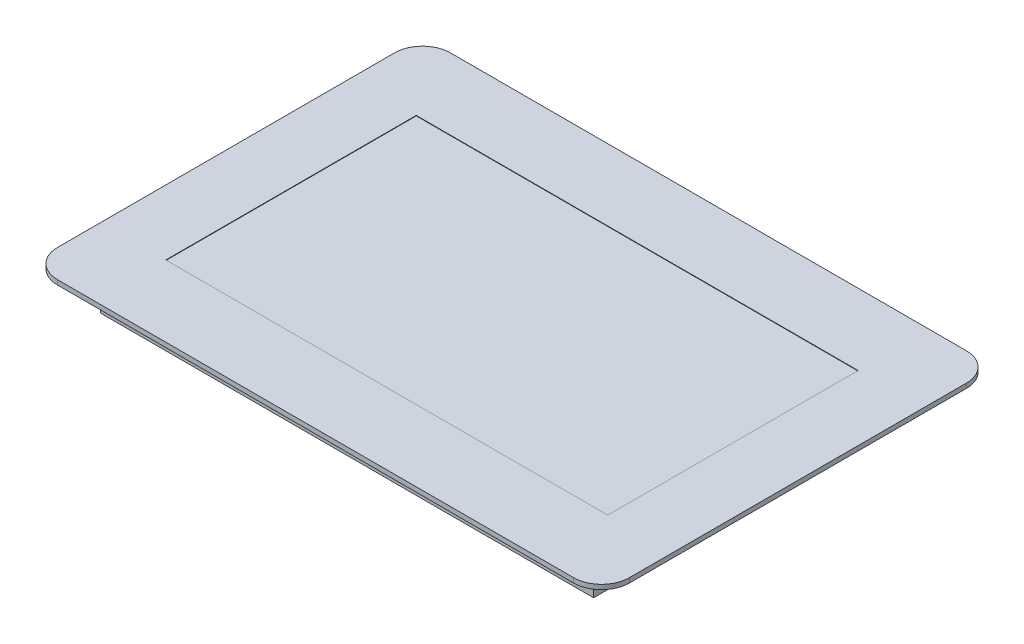
ISO-10303-21;
HEADER;
FILE_DESCRIPTION(('STEP AP214'),'2;1');
FILE_NAME('part.step','',(''),(''),'','','');
FILE_SCHEMA(('AUTOMOTIVE_DESIGN { 1 0 10303 214 1 1 1 1 }'));
ENDSEC;
DATA;
#1=APPLICATION_CONTEXT('core data for automotive mechanical design processes');
#2=APPLICATION_PROTOCOL_DEFINITION('international standard','automotive_design',2000,#1);
#3=PRODUCT_CONTEXT('',#1,'mechanical');
#4=PRODUCT('Part','Part','',(#3));
#5=PRODUCT_RELATED_PRODUCT_CATEGORY('part','',(#4));
#6=PRODUCT_DEFINITION_FORMATION('','',#4);
#7=PRODUCT_DEFINITION_CONTEXT('part definition',#1,'design');
#8=PRODUCT_DEFINITION('design','',#6,#7);
#9=PRODUCT_DEFINITION_SHAPE('','',#8);
#10=(LENGTH_UNIT() NAMED_UNIT(*) SI_UNIT(.MILLI.,.METRE.));
#11=(NAMED_UNIT(*) PLANE_ANGLE_UNIT() SI_UNIT($,.RADIAN.));
#12=(NAMED_UNIT(*) SI_UNIT($,.STERADIAN.) SOLID_ANGLE_UNIT());
#13=UNCERTAINTY_MEASURE_WITH_UNIT(LENGTH_MEASURE(1.E-05),#10,'distance_accuracy_value','');
#14=(GEOMETRIC_REPRESENTATION_CONTEXT(3) GLOBAL_UNCERTAINTY_ASSIGNED_CONTEXT((#13)) GLOBAL_UNIT_ASSIGNED_CONTEXT((#10,
#11,#12)) REPRESENTATION_CONTEXT('',''));
#15=CARTESIAN_POINT('',(0.,0.,0.));
#16=DIRECTION('',(0.,0.,1.));
#17=DIRECTION('',(1.,0.,0.));
#18=AXIS2_PLACEMENT_3D('',#15,#16,#17);
#19=CARTESIAN_POINT('',(53.,8.4,-33.85));
#20=DIRECTION('',(-1.,0.,0.));
#21=DIRECTION('',(0.,0.,1.));
#22=AXIS2_PLACEMENT_3D('',#19,#20,#21);
#23=PLANE('',#22);
#24=DIRECTION('',(0.,0.,-1.));
#25=VECTOR('',#24,1.);
#26=CARTESIAN_POINT('',(53.,7.4,-33.85));
#27=LINE('',#26,#25);
#28=CARTESIAN_POINT('',(53.,7.4,33.85));
#29=VERTEX_POINT('',#28);
#30=CARTESIAN_POINT('',(53.,7.4,-33.85));
#31=VERTEX_POINT('',#30);
#32=EDGE_CURVE('E254',#29,#31,#27,.T.);
#33=ORIENTED_EDGE('',*,*,#32,.F.);
#34=DIRECTION('',(0.,-1.,0.));
#35=VECTOR('',#34,1.);
#36=CARTESIAN_POINT('',(53.,8.4,33.85));
#37=LINE('',#36,#35);
#38=CARTESIAN_POINT('',(53.,0.,33.85));
#39=VERTEX_POINT('',#38);
#40=EDGE_CURVE('E269',#29,#39,#37,.T.);
#41=ORIENTED_EDGE('',*,*,#40,.T.);
#42=DIRECTION('',(0.,0.,-1.));
#43=VECTOR('',#42,1.);
#44=CARTESIAN_POINT('',(53.,0.,-33.85));
#45=LINE('',#44,#43);
#46=CARTESIAN_POINT('',(53.,0.,-33.85));
#47=VERTEX_POINT('',#46);
#48=EDGE_CURVE('E257',#39,#47,#45,.T.);
#49=ORIENTED_EDGE('',*,*,#48,.T.);
#50=DIRECTION('',(0.,-1.,0.));
#51=VECTOR('',#50,1.);
#52=CARTESIAN_POINT('',(53.,8.4,-33.85));
#53=LINE('',#52,#51);
#54=EDGE_CURVE('E42',#31,#47,#53,.T.);
#55=ORIENTED_EDGE('',*,*,#54,.F.);
#56=EDGE_LOOP('',(#33,#41,#49,#55));
#57=FACE_BOUND('',#56,.T.);
#58=ADVANCED_FACE('F35',(#57),#23,.F.);
#59=CARTESIAN_POINT('',(-53.,8.4,-33.85));
#60=DIRECTION('',(0.,0.,1.));
#61=DIRECTION('',(1.,0.,0.));
#62=AXIS2_PLACEMENT_3D('',#59,#60,#61);
#63=PLANE('',#62);
#64=DIRECTION('',(-1.,0.,0.));
#65=VECTOR('',#64,1.);
#66=CARTESIAN_POINT('',(-53.,7.4,-33.85));
#67=LINE('',#66,#65);
#68=CARTESIAN_POINT('',(-53.,7.4,-33.85));
#69=VERTEX_POINT('',#68);
#70=EDGE_CURVE('E57',#31,#69,#67,.T.);
#71=ORIENTED_EDGE('',*,*,#70,.F.);
#72=ORIENTED_EDGE('',*,*,#54,.T.);
#73=DIRECTION('',(-1.,0.,0.));
#74=VECTOR('',#73,1.);
#75=CARTESIAN_POINT('',(-53.,0.,-33.85));
#76=LINE('',#75,#74);
#77=CARTESIAN_POINT('',(-53.,0.,-33.85));
#78=VERTEX_POINT('',#77);
#79=EDGE_CURVE('E260',#47,#78,#76,.T.);
#80=ORIENTED_EDGE('',*,*,#79,.T.);
#81=DIRECTION('',(0.,-1.,0.));
#82=VECTOR('',#81,1.);
#83=CARTESIAN_POINT('',(-53.,8.4,-33.85));
#84=LINE('',#83,#82);
#85=EDGE_CURVE('E273',#69,#78,#84,.T.);
#86=ORIENTED_EDGE('',*,*,#85,.F.);
#87=EDGE_LOOP('',(#71,#72,#80,#86));
#88=FACE_BOUND('',#87,.T.);
#89=ADVANCED_FACE('F275',(#88),#63,.F.);
#90=CARTESIAN_POINT('',(-53.,8.4,-33.85));
#91=DIRECTION('',(1.,0.,0.));
#92=DIRECTION('',(0.,0.,-1.));
#93=AXIS2_PLACEMENT_3D('',#90,#91,#92);
#94=PLANE('',#93);
#95=DIRECTION('',(0.,0.,1.));
#96=VECTOR('',#95,1.);
#97=CARTESIAN_POINT('',(-53.,7.4,-33.85));
#98=LINE('',#97,#96);
#99=CARTESIAN_POINT('',(-53.,7.4,33.85));
#100=VERTEX_POINT('',#99);
#101=EDGE_CURVE('E237',#69,#100,#98,.T.);
#102=ORIENTED_EDGE('',*,*,#101,.F.);
#103=ORIENTED_EDGE('',*,*,#85,.T.);
#104=DIRECTION('',(0.,0.,1.));
#105=VECTOR('',#104,1.);
#106=CARTESIAN_POINT('',(-53.,0.,-33.85));
#107=LINE('',#106,#105);
#108=CARTESIAN_POINT('',(-53.,0.,33.85));
#109=VERTEX_POINT('',#108);
#110=EDGE_CURVE('E263',#78,#109,#107,.T.);
#111=ORIENTED_EDGE('',*,*,#110,.T.);
#112=DIRECTION('',(0.,-1.,0.));
#113=VECTOR('',#112,1.);
#114=CARTESIAN_POINT('',(-53.,8.4,33.85));
#115=LINE('',#114,#113);
#116=EDGE_CURVE('E271',#100,#109,#115,.T.);
#117=ORIENTED_EDGE('',*,*,#116,.F.);
#118=EDGE_LOOP('',(#102,#103,#111,#117));
#119=FACE_BOUND('',#118,.T.);
#120=ADVANCED_FACE('F287',(#119),#94,.F.);
#121=CARTESIAN_POINT('',(-53.,8.4,33.85));
#122=DIRECTION('',(0.,0.,-1.));
#123=DIRECTION('',(-1.,0.,0.));
#124=AXIS2_PLACEMENT_3D('',#121,#122,#123);
#125=PLANE('',#124);
#126=DIRECTION('',(1.,0.,0.));
#127=VECTOR('',#126,1.);
#128=CARTESIAN_POINT('',(-53.,7.4,33.85));
#129=LINE('',#128,#127);
#130=EDGE_CURVE('E11',#100,#29,#129,.T.);
#131=ORIENTED_EDGE('',*,*,#130,.F.);
#132=ORIENTED_EDGE('',*,*,#116,.T.);
#133=DIRECTION('',(1.,0.,0.));
#134=VECTOR('',#133,1.);
#135=CARTESIAN_POINT('',(-53.,0.,33.85));
#136=LINE('',#135,#134);
#137=EDGE_CURVE('E266',#109,#39,#136,.T.);
#138=ORIENTED_EDGE('',*,*,#137,.T.);
#139=ORIENTED_EDGE('',*,*,#40,.F.);
#140=EDGE_LOOP('',(#131,#132,#138,#139));
#141=FACE_BOUND('',#140,.T.);
#142=ADVANCED_FACE('F284',(#141),#125,.F.);
#143=CARTESIAN_POINT('',(0.,0.,0.));
#144=DIRECTION('',(0.,1.,0.));
#145=DIRECTION('',(0.,0.,1.));
#146=AXIS2_PLACEMENT_3D('',#143,#144,#145);
#147=PLANE('',#146);
#148=ORIENTED_EDGE('',*,*,#48,.F.);
#149=ORIENTED_EDGE('',*,*,#137,.F.);
#150=ORIENTED_EDGE('',*,*,#110,.F.);
#151=ORIENTED_EDGE('',*,*,#79,.F.);
#152=EDGE_LOOP('',(#148,#149,#150,#151));
#153=FACE_BOUND('',#152,.T.);
#154=ADVANCED_FACE('F281',(#153),#147,.F.);
#155=CARTESIAN_POINT('',(-55.5,7.4,34.65));
#156=DIRECTION('',(0.,1.,0.));
#157=DIRECTION('',(0.,0.,1.));
#158=AXIS2_PLACEMENT_3D('',#155,#156,#157);
#159=PLANE('',#158);
#160=CARTESIAN_POINT('',(-55.5,7.4,34.65));
#161=DIRECTION('',(0.,1.,0.));
#162=DIRECTION('',(0.,0.,1.));
#163=AXIS2_PLACEMENT_3D('',#160,#161,#162);
#164=CIRCLE('',#163,6.);
#165=CARTESIAN_POINT('',(-61.5,7.4,34.65));
#166=VERTEX_POINT('',#165);
#167=CARTESIAN_POINT('',(-55.5,7.4,40.65));
#168=VERTEX_POINT('',#167);
#169=EDGE_CURVE('E187',#166,#168,#164,.T.);
#170=ORIENTED_EDGE('',*,*,#169,.F.);
#171=DIRECTION('',(0.,0.,1.));
#172=VECTOR('',#171,1.);
#173=CARTESIAN_POINT('',(-61.5,7.4,-37.8499999999999));
#174=LINE('',#173,#172);
#175=CARTESIAN_POINT('',(-61.5,7.4,-37.8499999999999));
#176=VERTEX_POINT('',#175);
#177=EDGE_CURVE('E209',#176,#166,#174,.T.);
#178=ORIENTED_EDGE('',*,*,#177,.F.);
#179=CARTESIAN_POINT('',(-55.5,7.4,-37.85));
#180=DIRECTION('',(0.,1.,0.));
#181=DIRECTION('',(0.,0.,1.));
#182=AXIS2_PLACEMENT_3D('',#179,#180,#181);
#183=CIRCLE('',#182,6.);
#184=CARTESIAN_POINT('',(-55.5,7.4,-43.85));
#185=VERTEX_POINT('',#184);
#186=EDGE_CURVE('E206',#185,#176,#183,.T.);
#187=ORIENTED_EDGE('',*,*,#186,.F.);
#188=DIRECTION('',(-1.,0.,0.));
#189=VECTOR('',#188,1.);
#190=CARTESIAN_POINT('',(-55.5,7.4,-43.85));
#191=LINE('',#190,#189);
#192=CARTESIAN_POINT('',(55.5,7.4,-43.85));
#193=VERTEX_POINT('',#192);
#194=EDGE_CURVE('E203',#193,#185,#191,.T.);
#195=ORIENTED_EDGE('',*,*,#194,.F.);
#196=CARTESIAN_POINT('',(55.5,7.4,-37.85));
#197=DIRECTION('',(0.,1.,0.));
#198=DIRECTION('',(0.,0.,-1.));
#199=AXIS2_PLACEMENT_3D('',#196,#197,#198);
#200=CIRCLE('',#199,6.);
#201=CARTESIAN_POINT('',(61.5,7.4,-37.8499999999999));
#202=VERTEX_POINT('',#201);
#203=EDGE_CURVE('E200',#202,#193,#200,.T.);
#204=ORIENTED_EDGE('',*,*,#203,.F.);
#205=DIRECTION('',(0.,0.,-1.));
#206=VECTOR('',#205,1.);
#207=CARTESIAN_POINT('',(61.5,7.4,-37.8499999999999));
#208=LINE('',#207,#206);
#209=CARTESIAN_POINT('',(61.5,7.4,34.65));
#210=VERTEX_POINT('',#209);
#211=EDGE_CURVE('E197',#210,#202,#208,.T.);
#212=ORIENTED_EDGE('',*,*,#211,.F.);
#213=CARTESIAN_POINT('',(55.5,7.4,34.65));
#214=DIRECTION('',(0.,1.,0.));
#215=DIRECTION('',(0.,0.,1.));
#216=AXIS2_PLACEMENT_3D('',#213,#214,#215);
#217=CIRCLE('',#216,6.);
#218=CARTESIAN_POINT('',(55.5,7.4,40.65));
#219=VERTEX_POINT('',#218);
#220=EDGE_CURVE('E194',#219,#210,#217,.T.);
#221=ORIENTED_EDGE('',*,*,#220,.F.);
#222=DIRECTION('',(1.,0.,0.));
#223=VECTOR('',#222,1.);
#224=CARTESIAN_POINT('',(-55.5,7.4,40.65));
#225=LINE('',#224,#223);
#226=EDGE_CURVE('E190',#168,#219,#225,.T.);
#227=ORIENTED_EDGE('',*,*,#226,.F.);
#228=EDGE_LOOP('',(#170,#178,#187,#195,#204,#212,#221,#227));
#229=FACE_BOUND('',#228,.T.);
#230=ORIENTED_EDGE('',*,*,#130,.T.);
#231=ORIENTED_EDGE('',*,*,#32,.T.);
#232=ORIENTED_EDGE('',*,*,#70,.T.);
#233=ORIENTED_EDGE('',*,*,#101,.T.);
#234=EDGE_LOOP('',(#230,#231,#232,#233));
#235=FACE_BOUND('',#234,.T.);
#236=ADVANCED_FACE('F289',(#229,#235),#159,.F.);
#237=CARTESIAN_POINT('',(-55.5,7.4,34.65));
#238=DIRECTION('',(0.,1.,0.));
#239=DIRECTION('',(0.,0.,1.));
#240=AXIS2_PLACEMENT_3D('',#237,#238,#239);
#241=CYLINDRICAL_SURFACE('',#240,6.);
#242=CARTESIAN_POINT('',(-55.5,8.4,34.65));
#243=DIRECTION('',(0.,1.,0.));
#244=DIRECTION('',(0.,0.,1.));
#245=AXIS2_PLACEMENT_3D('',#242,#243,#244);
#246=CIRCLE('',#245,6.);
#247=CARTESIAN_POINT('',(-61.5,8.4,34.65));
#248=VERTEX_POINT('',#247);
#249=CARTESIAN_POINT('',(-55.5,8.4,40.65));
#250=VERTEX_POINT('',#249);
#251=EDGE_CURVE('E183',#248,#250,#246,.T.);
#252=ORIENTED_EDGE('',*,*,#251,.F.);
#253=DIRECTION('',(0.,1.,0.));
#254=VECTOR('',#253,1.);
#255=CARTESIAN_POINT('',(-61.5,7.4,34.65));
#256=LINE('',#255,#254);
#257=EDGE_CURVE('E235',#166,#248,#256,.T.);
#258=ORIENTED_EDGE('',*,*,#257,.F.);
#259=ORIENTED_EDGE('',*,*,#169,.T.);
#260=DIRECTION('',(0.,1.,0.));
#261=VECTOR('',#260,1.);
#262=CARTESIAN_POINT('',(-55.5,7.4,40.65));
#263=LINE('',#262,#261);
#264=EDGE_CURVE('E212',#168,#250,#263,.T.);
#265=ORIENTED_EDGE('',*,*,#264,.T.);
#266=EDGE_LOOP('',(#252,#258,#259,#265));
#267=FACE_BOUND('',#266,.T.);
#268=ADVANCED_FACE('F291',(#267),#241,.T.);
#269=CARTESIAN_POINT('',(-61.5,7.4,-37.8499999999999));
#270=DIRECTION('',(-1.,0.,0.));
#271=DIRECTION('',(0.,0.,1.));
#272=AXIS2_PLACEMENT_3D('',#269,#270,#271);
#273=PLANE('',#272);
#274=DIRECTION('',(0.,0.,1.));
#275=VECTOR('',#274,1.);
#276=CARTESIAN_POINT('',(-61.5,8.4,-37.8499999999999));
#277=LINE('',#276,#275);
#278=CARTESIAN_POINT('',(-61.5,8.4,-37.8499999999999));
#279=VERTEX_POINT('',#278);
#280=EDGE_CURVE('E191',#279,#248,#277,.T.);
#281=ORIENTED_EDGE('',*,*,#280,.F.);
#282=DIRECTION('',(0.,1.,0.));
#283=VECTOR('',#282,1.);
#284=CARTESIAN_POINT('',(-61.5,7.4,-37.8499999999999));
#285=LINE('',#284,#283);
#286=EDGE_CURVE('E238',#176,#279,#285,.T.);
#287=ORIENTED_EDGE('',*,*,#286,.F.);
#288=ORIENTED_EDGE('',*,*,#177,.T.);
#289=ORIENTED_EDGE('',*,*,#257,.T.);
#290=EDGE_LOOP('',(#281,#287,#288,#289));
#291=FACE_BOUND('',#290,.T.);
#292=ADVANCED_FACE('F298',(#291),#273,.T.);
#293=CARTESIAN_POINT('',(-55.5,7.4,-37.85));
#294=DIRECTION('',(0.,1.,0.));
#295=DIRECTION('',(0.,0.,1.));
#296=AXIS2_PLACEMENT_3D('',#293,#294,#295);
#297=CYLINDRICAL_SURFACE('',#296,6.);
#298=CARTESIAN_POINT('',(-55.5,8.4,-37.85));
#299=DIRECTION('',(0.,1.,0.));
#300=DIRECTION('',(0.,0.,1.));
#301=AXIS2_PLACEMENT_3D('',#298,#299,#300);
#302=CIRCLE('',#301,6.);
#303=CARTESIAN_POINT('',(-55.5,8.4,-43.85));
#304=VERTEX_POINT('',#303);
#305=EDGE_CURVE('E230',#304,#279,#302,.T.);
#306=ORIENTED_EDGE('',*,*,#305,.F.);
#307=DIRECTION('',(0.,1.,0.));
#308=VECTOR('',#307,1.);
#309=CARTESIAN_POINT('',(-55.5,7.4,-43.85));
#310=LINE('',#309,#308);
#311=EDGE_CURVE('E240',#185,#304,#310,.T.);
#312=ORIENTED_EDGE('',*,*,#311,.F.);
#313=ORIENTED_EDGE('',*,*,#186,.T.);
#314=ORIENTED_EDGE('',*,*,#286,.T.);
#315=EDGE_LOOP('',(#306,#312,#313,#314));
#316=FACE_BOUND('',#315,.T.);
#317=ADVANCED_FACE('F339',(#316),#297,.T.);
#318=CARTESIAN_POINT('',(-55.5,7.4,-43.85));
#319=DIRECTION('',(0.,0.,-1.));
#320=DIRECTION('',(-1.,0.,0.));
#321=AXIS2_PLACEMENT_3D('',#318,#319,#320);
#322=PLANE('',#321);
#323=DIRECTION('',(-1.,0.,0.));
#324=VECTOR('',#323,1.);
#325=CARTESIAN_POINT('',(-55.5,8.4,-43.85));
#326=LINE('',#325,#324);
#327=CARTESIAN_POINT('',(55.5,8.4,-43.85));
#328=VERTEX_POINT('',#327);
#329=EDGE_CURVE('E227',#328,#304,#326,.T.);
#330=ORIENTED_EDGE('',*,*,#329,.F.);
#331=DIRECTION('',(0.,1.,0.));
#332=VECTOR('',#331,1.);
#333=CARTESIAN_POINT('',(55.5,7.4,-43.85));
#334=LINE('',#333,#332);
#335=EDGE_CURVE('E242',#193,#328,#334,.T.);
#336=ORIENTED_EDGE('',*,*,#335,.F.);
#337=ORIENTED_EDGE('',*,*,#194,.T.);
#338=ORIENTED_EDGE('',*,*,#311,.T.);
#339=EDGE_LOOP('',(#330,#336,#337,#338));
#340=FACE_BOUND('',#339,.T.);
#341=ADVANCED_FACE('F335',(#340),#322,.T.);
#342=CARTESIAN_POINT('',(55.5,7.4,-37.85));
#343=DIRECTION('',(0.,1.,0.));
#344=DIRECTION('',(0.,0.,1.));
#345=AXIS2_PLACEMENT_3D('',#342,#343,#344);
#346=CYLINDRICAL_SURFACE('',#345,6.);
#347=CARTESIAN_POINT('',(55.5,8.4,-37.85));
#348=DIRECTION('',(0.,1.,0.));
#349=DIRECTION('',(0.,0.,-1.));
#350=AXIS2_PLACEMENT_3D('',#347,#348,#349);
#351=CIRCLE('',#350,6.);
#352=CARTESIAN_POINT('',(61.5,8.4,-37.8499999999999));
#353=VERTEX_POINT('',#352);
#354=EDGE_CURVE('E224',#353,#328,#351,.T.);
#355=ORIENTED_EDGE('',*,*,#354,.F.);
#356=DIRECTION('',(0.,1.,0.));
#357=VECTOR('',#356,1.);
#358=CARTESIAN_POINT('',(61.5,7.4,-37.8499999999999));
#359=LINE('',#358,#357);
#360=EDGE_CURVE('E244',#202,#353,#359,.T.);
#361=ORIENTED_EDGE('',*,*,#360,.F.);
#362=ORIENTED_EDGE('',*,*,#203,.T.);
#363=ORIENTED_EDGE('',*,*,#335,.T.);
#364=EDGE_LOOP('',(#355,#361,#362,#363));
#365=FACE_BOUND('',#364,.T.);
#366=ADVANCED_FACE('F331',(#365),#346,.T.);
#367=CARTESIAN_POINT('',(61.5,7.4,-37.8499999999999));
#368=DIRECTION('',(1.,0.,0.));
#369=DIRECTION('',(0.,0.,-1.));
#370=AXIS2_PLACEMENT_3D('',#367,#368,#369);
#371=PLANE('',#370);
#372=DIRECTION('',(0.,0.,-1.));
#373=VECTOR('',#372,1.);
#374=CARTESIAN_POINT('',(61.5,8.4,-37.8499999999999));
#375=LINE('',#374,#373);
#376=CARTESIAN_POINT('',(61.5,8.4,34.65));
#377=VERTEX_POINT('',#376);
#378=EDGE_CURVE('E221',#377,#353,#375,.T.);
#379=ORIENTED_EDGE('',*,*,#378,.F.);
#380=DIRECTION('',(0.,1.,0.));
#381=VECTOR('',#380,1.);
#382=CARTESIAN_POINT('',(61.5,7.4,34.65));
#383=LINE('',#382,#381);
#384=EDGE_CURVE('E246',#210,#377,#383,.T.);
#385=ORIENTED_EDGE('',*,*,#384,.F.);
#386=ORIENTED_EDGE('',*,*,#211,.T.);
#387=ORIENTED_EDGE('',*,*,#360,.T.);
#388=EDGE_LOOP('',(#379,#385,#386,#387));
#389=FACE_BOUND('',#388,.T.);
#390=ADVANCED_FACE('F327',(#389),#371,.T.);
#391=CARTESIAN_POINT('',(55.5,7.4,34.65));
#392=DIRECTION('',(0.,1.,0.));
#393=DIRECTION('',(0.,0.,1.));
#394=AXIS2_PLACEMENT_3D('',#391,#392,#393);
#395=CYLINDRICAL_SURFACE('',#394,6.);
#396=CARTESIAN_POINT('',(55.5,8.4,34.65));
#397=DIRECTION('',(0.,1.,0.));
#398=DIRECTION('',(0.,0.,1.));
#399=AXIS2_PLACEMENT_3D('',#396,#397,#398);
#400=CIRCLE('',#399,6.);
#401=CARTESIAN_POINT('',(55.5,8.4,40.65));
#402=VERTEX_POINT('',#401);
#403=EDGE_CURVE('E218',#402,#377,#400,.T.);
#404=ORIENTED_EDGE('',*,*,#403,.F.);
#405=DIRECTION('',(0.,1.,0.));
#406=VECTOR('',#405,1.);
#407=CARTESIAN_POINT('',(55.5,7.4,40.65));
#408=LINE('',#407,#406);
#409=EDGE_CURVE('E248',#219,#402,#408,.T.);
#410=ORIENTED_EDGE('',*,*,#409,.F.);
#411=ORIENTED_EDGE('',*,*,#220,.T.);
#412=ORIENTED_EDGE('',*,*,#384,.T.);
#413=EDGE_LOOP('',(#404,#410,#411,#412));
#414=FACE_BOUND('',#413,.T.);
#415=ADVANCED_FACE('F323',(#414),#395,.T.);
#416=CARTESIAN_POINT('',(-55.5,7.4,40.65));
#417=DIRECTION('',(0.,0.,1.));
#418=DIRECTION('',(1.,0.,0.));
#419=AXIS2_PLACEMENT_3D('',#416,#417,#418);
#420=PLANE('',#419);
#421=DIRECTION('',(1.,0.,0.));
#422=VECTOR('',#421,1.);
#423=CARTESIAN_POINT('',(-55.5,8.4,40.65));
#424=LINE('',#423,#422);
#425=EDGE_CURVE('E215',#250,#402,#424,.T.);
#426=ORIENTED_EDGE('',*,*,#425,.F.);
#427=ORIENTED_EDGE('',*,*,#264,.F.);
#428=ORIENTED_EDGE('',*,*,#226,.T.);
#429=ORIENTED_EDGE('',*,*,#409,.T.);
#430=EDGE_LOOP('',(#426,#427,#428,#429));
#431=FACE_BOUND('',#430,.T.);
#432=ADVANCED_FACE('F318',(#431),#420,.T.);
#433=CARTESIAN_POINT('',(0.,8.4,0.));
#434=DIRECTION('',(0.,1.,0.));
#435=DIRECTION('',(0.,0.,1.));
#436=AXIS2_PLACEMENT_3D('',#433,#434,#435);
#437=PLANE('',#436);
#438=DIRECTION('',(0.,0.,-1.));
#439=VECTOR('',#438,1.);
#440=CARTESIAN_POINT('',(47.52,8.4,-28.53));
#441=LINE('',#440,#439);
#442=CARTESIAN_POINT('',(47.52,8.4,25.33));
#443=VERTEX_POINT('',#442);
#444=CARTESIAN_POINT('',(47.52,8.4,-28.53));
#445=VERTEX_POINT('',#444);
#446=EDGE_CURVE('E49',#443,#445,#441,.T.);
#447=ORIENTED_EDGE('',*,*,#446,.F.);
#448=DIRECTION('',(1.,0.,0.));
#449=VECTOR('',#448,1.);
#450=CARTESIAN_POINT('',(-47.52,8.4,25.33));
#451=LINE('',#450,#449);
#452=CARTESIAN_POINT('',(-47.52,8.4,25.33));
#453=VERTEX_POINT('',#452);
#454=EDGE_CURVE('E168',#453,#443,#451,.T.);
#455=ORIENTED_EDGE('',*,*,#454,.F.);
#456=DIRECTION('',(0.,0.,1.));
#457=VECTOR('',#456,1.);
#458=CARTESIAN_POINT('',(-47.52,8.4,-28.53));
#459=LINE('',#458,#457);
#460=CARTESIAN_POINT('',(-47.52,8.4,-28.53));
#461=VERTEX_POINT('',#460);
#462=EDGE_CURVE('E171',#461,#453,#459,.T.);
#463=ORIENTED_EDGE('',*,*,#462,.F.);
#464=DIRECTION('',(-1.,0.,0.));
#465=VECTOR('',#464,1.);
#466=CARTESIAN_POINT('',(-47.52,8.4,-28.53));
#467=LINE('',#466,#465);
#468=EDGE_CURVE('E177',#445,#461,#467,.T.);
#469=ORIENTED_EDGE('',*,*,#468,.F.);
#470=EDGE_LOOP('',(#447,#455,#463,#469));
#471=FACE_BOUND('',#470,.T.);
#472=ORIENTED_EDGE('',*,*,#251,.T.);
#473=ORIENTED_EDGE('',*,*,#425,.T.);
#474=ORIENTED_EDGE('',*,*,#403,.T.);
#475=ORIENTED_EDGE('',*,*,#378,.T.);
#476=ORIENTED_EDGE('',*,*,#354,.T.);
#477=ORIENTED_EDGE('',*,*,#329,.T.);
#478=ORIENTED_EDGE('',*,*,#305,.T.);
#479=ORIENTED_EDGE('',*,*,#280,.T.);
#480=EDGE_LOOP('',(#472,#473,#474,#475,#476,#477,#478,#479));
#481=FACE_BOUND('',#480,.T.);
#482=ADVANCED_FACE('F316',(#471,#481),#437,.T.);
#483=CARTESIAN_POINT('',(47.52,8.3,-28.53));
#484=DIRECTION('',(1.,0.,0.));
#485=DIRECTION('',(0.,0.,-1.));
#486=AXIS2_PLACEMENT_3D('',#483,#484,#485);
#487=PLANE('',#486);
#488=ORIENTED_EDGE('',*,*,#446,.T.);
#489=DIRECTION('',(0.,1.,0.));
#490=VECTOR('',#489,1.);
#491=CARTESIAN_POINT('',(47.52,8.3,-28.53));
#492=LINE('',#491,#490);
#493=CARTESIAN_POINT('',(47.52,8.3,-28.53));
#494=VERTEX_POINT('',#493);
#495=EDGE_CURVE('E146',#494,#445,#492,.T.);
#496=ORIENTED_EDGE('',*,*,#495,.F.);
#497=DIRECTION('',(0.,0.,-1.));
#498=VECTOR('',#497,1.);
#499=CARTESIAN_POINT('',(47.52,8.3,-28.53));
#500=LINE('',#499,#498);
#501=CARTESIAN_POINT('',(47.52,8.3,25.33));
#502=VERTEX_POINT('',#501);
#503=EDGE_CURVE('E150',#502,#494,#500,.T.);
#504=ORIENTED_EDGE('',*,*,#503,.F.);
#505=DIRECTION('',(0.,1.,0.));
#506=VECTOR('',#505,1.);
#507=CARTESIAN_POINT('',(47.52,8.3,25.33));
#508=LINE('',#507,#506);
#509=EDGE_CURVE('E181',#502,#443,#508,.T.);
#510=ORIENTED_EDGE('',*,*,#509,.T.);
#511=EDGE_LOOP('',(#488,#496,#504,#510));
#512=FACE_BOUND('',#511,.T.);
#513=ADVANCED_FACE('F148',(#512),#487,.F.);
#514=CARTESIAN_POINT('',(-47.52,8.3,25.33));
#515=DIRECTION('',(0.,0.,1.));
#516=DIRECTION('',(1.,0.,0.));
#517=AXIS2_PLACEMENT_3D('',#514,#515,#516);
#518=PLANE('',#517);
#519=ORIENTED_EDGE('',*,*,#454,.T.);
#520=ORIENTED_EDGE('',*,*,#509,.F.);
#521=DIRECTION('',(1.,0.,0.));
#522=VECTOR('',#521,1.);
#523=CARTESIAN_POINT('',(-47.52,8.3,25.33));
#524=LINE('',#523,#522);
#525=CARTESIAN_POINT('',(-47.52,8.3,25.33));
#526=VERTEX_POINT('',#525);
#527=EDGE_CURVE('E156',#526,#502,#524,.T.);
#528=ORIENTED_EDGE('',*,*,#527,.F.);
#529=DIRECTION('',(0.,1.,0.));
#530=VECTOR('',#529,1.);
#531=CARTESIAN_POINT('',(-47.52,8.3,25.33));
#532=LINE('',#531,#530);
#533=EDGE_CURVE('E184',#526,#453,#532,.T.);
#534=ORIENTED_EDGE('',*,*,#533,.T.);
#535=EDGE_LOOP('',(#519,#520,#528,#534));
#536=FACE_BOUND('',#535,.T.);
#537=ADVANCED_FACE('F400',(#536),#518,.F.);
#538=CARTESIAN_POINT('',(-47.52,8.3,-28.53));
#539=DIRECTION('',(-1.,0.,0.));
#540=DIRECTION('',(0.,0.,1.));
#541=AXIS2_PLACEMENT_3D('',#538,#539,#540);
#542=PLANE('',#541);
#543=ORIENTED_EDGE('',*,*,#462,.T.);
#544=ORIENTED_EDGE('',*,*,#533,.F.);
#545=DIRECTION('',(0.,0.,1.));
#546=VECTOR('',#545,1.);
#547=CARTESIAN_POINT('',(-47.52,8.3,-28.53));
#548=LINE('',#547,#546);
#549=CARTESIAN_POINT('',(-47.52,8.3,-28.53));
#550=VERTEX_POINT('',#549);
#551=EDGE_CURVE('E164',#550,#526,#548,.T.);
#552=ORIENTED_EDGE('',*,*,#551,.F.);
#553=DIRECTION('',(0.,1.,0.));
#554=VECTOR('',#553,1.);
#555=CARTESIAN_POINT('',(-47.52,8.3,-28.53));
#556=LINE('',#555,#554);
#557=EDGE_CURVE('E155',#550,#461,#556,.T.);
#558=ORIENTED_EDGE('',*,*,#557,.T.);
#559=EDGE_LOOP('',(#543,#544,#552,#558));
#560=FACE_BOUND('',#559,.T.);
#561=ADVANCED_FACE('F406',(#560),#542,.F.);
#562=CARTESIAN_POINT('',(-47.52,8.3,-28.53));
#563=DIRECTION('',(0.,0.,-1.));
#564=DIRECTION('',(-1.,0.,0.));
#565=AXIS2_PLACEMENT_3D('',#562,#563,#564);
#566=PLANE('',#565);
#567=ORIENTED_EDGE('',*,*,#468,.T.);
#568=ORIENTED_EDGE('',*,*,#557,.F.);
#569=DIRECTION('',(-1.,0.,0.));
#570=VECTOR('',#569,1.);
#571=CARTESIAN_POINT('',(-47.52,8.3,-28.53));
#572=LINE('',#571,#570);
#573=EDGE_CURVE('E159',#494,#550,#572,.T.);
#574=ORIENTED_EDGE('',*,*,#573,.F.);
#575=ORIENTED_EDGE('',*,*,#495,.T.);
#576=EDGE_LOOP('',(#567,#568,#574,#575));
#577=FACE_BOUND('',#576,.T.);
#578=ADVANCED_FACE('F160',(#577),#566,.F.);
#579=CARTESIAN_POINT('',(0.,8.3,0.));
#580=DIRECTION('',(0.,1.,0.));
#581=DIRECTION('',(0.,0.,1.));
#582=AXIS2_PLACEMENT_3D('',#579,#580,#581);
#583=PLANE('',#582);
#584=ORIENTED_EDGE('',*,*,#503,.T.);
#585=ORIENTED_EDGE('',*,*,#573,.T.);
#586=ORIENTED_EDGE('',*,*,#551,.T.);
#587=ORIENTED_EDGE('',*,*,#527,.T.);
#588=EDGE_LOOP('',(#584,#585,#586,#587));
#589=FACE_BOUND('',#588,.T.);
#590=ADVANCED_FACE('F166',(#589),#583,.T.);
#591=CLOSED_SHELL('',(#58,#89,#120,#142,#154,#236,#268,#292,#317,#341,#366,#390,#415,#432,#482,
#513,#537,#561,#578,#590));
#592=MANIFOLD_SOLID_BREP('B2',#591);
#593=ADVANCED_BREP_SHAPE_REPRESENTATION('',(#18,#592),#14);
#594=SHAPE_DEFINITION_REPRESENTATION(#9,#593);
ENDSEC;
END-ISO-10303-21;
